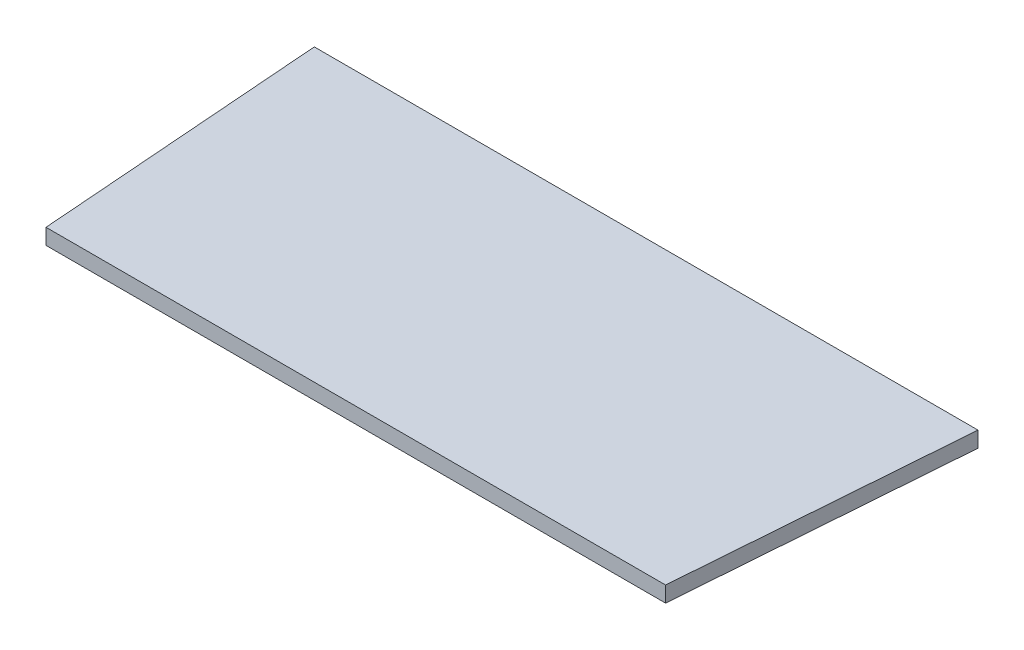
ISO-10303-21;
HEADER;
FILE_DESCRIPTION(('STEP AP214'),'2;1');
FILE_NAME('part.step','',(''),(''),'','','');
FILE_SCHEMA(('AUTOMOTIVE_DESIGN { 1 0 10303 214 1 1 1 1 }'));
ENDSEC;
DATA;
#1=APPLICATION_CONTEXT('core data for automotive mechanical design processes');
#2=APPLICATION_PROTOCOL_DEFINITION('international standard','automotive_design',2000,#1);
#3=PRODUCT_CONTEXT('',#1,'mechanical');
#4=PRODUCT('Part','Part','',(#3));
#5=PRODUCT_RELATED_PRODUCT_CATEGORY('part','',(#4));
#6=PRODUCT_DEFINITION_FORMATION('','',#4);
#7=PRODUCT_DEFINITION_CONTEXT('part definition',#1,'design');
#8=PRODUCT_DEFINITION('design','',#6,#7);
#9=PRODUCT_DEFINITION_SHAPE('','',#8);
#10=(LENGTH_UNIT() NAMED_UNIT(*) SI_UNIT(.MILLI.,.METRE.));
#11=(NAMED_UNIT(*) PLANE_ANGLE_UNIT() SI_UNIT($,.RADIAN.));
#12=(NAMED_UNIT(*) SI_UNIT($,.STERADIAN.) SOLID_ANGLE_UNIT());
#13=UNCERTAINTY_MEASURE_WITH_UNIT(LENGTH_MEASURE(1.E-05),#10,'distance_accuracy_value','');
#14=(GEOMETRIC_REPRESENTATION_CONTEXT(3) GLOBAL_UNCERTAINTY_ASSIGNED_CONTEXT((#13)) GLOBAL_UNIT_ASSIGNED_CONTEXT((#10,
#11,#12)) REPRESENTATION_CONTEXT('',''));
#15=CARTESIAN_POINT('',(0.,0.,0.));
#16=DIRECTION('',(0.,0.,1.));
#17=DIRECTION('',(1.,0.,0.));
#18=AXIS2_PLACEMENT_3D('',#15,#16,#17);
#19=CARTESIAN_POINT('',(-1045.5,26.5,490.));
#20=DIRECTION('',(0.997122913018406,0.,-0.0758016908366033));
#21=DIRECTION('',(-0.0758016908366033,0.,-0.997122913018406));
#22=AXIS2_PLACEMENT_3D('',#19,#20,#21);
#23=PLANE('',#22);
#24=DIRECTION('',(0.0758016908366033,0.,0.997122913018406));
#25=VECTOR('',#24,1.);
#26=CARTESIAN_POINT('',(-1045.5,-26.5,490.));
#27=LINE('',#26,#25);
#28=CARTESIAN_POINT('',(-1120.,-26.5,-490.));
#29=VERTEX_POINT('',#28);
#30=CARTESIAN_POINT('',(-1045.5,-26.5,490.));
#31=VERTEX_POINT('',#30);
#32=EDGE_CURVE('E97',#29,#31,#27,.T.);
#33=ORIENTED_EDGE('',*,*,#32,.T.);
#34=DIRECTION('',(0.,-1.,0.));
#35=VECTOR('',#34,1.);
#36=CARTESIAN_POINT('',(-1045.5,26.5,490.));
#37=LINE('',#36,#35);
#38=CARTESIAN_POINT('',(-1045.5,26.5,490.));
#39=VERTEX_POINT('',#38);
#40=EDGE_CURVE('E11',#39,#31,#37,.T.);
#41=ORIENTED_EDGE('',*,*,#40,.F.);
#42=DIRECTION('',(0.0758016908366033,0.,0.997122913018406));
#43=VECTOR('',#42,1.);
#44=CARTESIAN_POINT('',(-1045.5,26.5,490.));
#45=LINE('',#44,#43);
#46=CARTESIAN_POINT('',(-1120.,26.5,-490.));
#47=VERTEX_POINT('',#46);
#48=EDGE_CURVE('E85',#47,#39,#45,.T.);
#49=ORIENTED_EDGE('',*,*,#48,.F.);
#50=DIRECTION('',(0.,-1.,0.));
#51=VECTOR('',#50,1.);
#52=CARTESIAN_POINT('',(-1120.,26.5,-490.));
#53=LINE('',#52,#51);
#54=EDGE_CURVE('E93',#47,#29,#53,.T.);
#55=ORIENTED_EDGE('',*,*,#54,.T.);
#56=EDGE_LOOP('',(#33,#41,#49,#55));
#57=FACE_BOUND('',#56,.T.);
#58=ADVANCED_FACE('F34',(#57),#23,.F.);
#59=CARTESIAN_POINT('',(1045.5,26.5,490.));
#60=DIRECTION('',(0.,0.,-1.));
#61=DIRECTION('',(-1.,0.,0.));
#62=AXIS2_PLACEMENT_3D('',#59,#60,#61);
#63=PLANE('',#62);
#64=DIRECTION('',(1.,0.,0.));
#65=VECTOR('',#64,1.);
#66=CARTESIAN_POINT('',(1045.5,-26.5,490.));
#67=LINE('',#66,#65);
#68=CARTESIAN_POINT('',(1045.5,-26.5,490.));
#69=VERTEX_POINT('',#68);
#70=EDGE_CURVE('E89',#31,#69,#67,.T.);
#71=ORIENTED_EDGE('',*,*,#70,.T.);
#72=DIRECTION('',(0.,-1.,0.));
#73=VECTOR('',#72,1.);
#74=CARTESIAN_POINT('',(1045.5,26.5,490.));
#75=LINE('',#74,#73);
#76=CARTESIAN_POINT('',(1045.5,26.5,490.));
#77=VERTEX_POINT('',#76);
#78=EDGE_CURVE('E42',#77,#69,#75,.T.);
#79=ORIENTED_EDGE('',*,*,#78,.F.);
#80=DIRECTION('',(1.,0.,0.));
#81=VECTOR('',#80,1.);
#82=CARTESIAN_POINT('',(1045.5,26.5,490.));
#83=LINE('',#82,#81);
#84=EDGE_CURVE('E80',#39,#77,#83,.T.);
#85=ORIENTED_EDGE('',*,*,#84,.F.);
#86=ORIENTED_EDGE('',*,*,#40,.T.);
#87=EDGE_LOOP('',(#71,#79,#85,#86));
#88=FACE_BOUND('',#87,.T.);
#89=ADVANCED_FACE('F88',(#88),#63,.F.);
#90=CARTESIAN_POINT('',(1120.,26.5,-490.000000000001));
#91=DIRECTION('',(-0.997122913018406,0.,-0.0758016908366033));
#92=DIRECTION('',(-0.0758016908366033,0.,0.997122913018406));
#93=AXIS2_PLACEMENT_3D('',#90,#91,#92);
#94=PLANE('',#93);
#95=DIRECTION('',(0.0758016908366033,0.,-0.997122913018406));
#96=VECTOR('',#95,1.);
#97=CARTESIAN_POINT('',(1120.,-26.5,-490.000000000001));
#98=LINE('',#97,#96);
#99=CARTESIAN_POINT('',(1120.,-26.5,-490.000000000001));
#100=VERTEX_POINT('',#99);
#101=EDGE_CURVE('E67',#69,#100,#98,.T.);
#102=ORIENTED_EDGE('',*,*,#101,.T.);
#103=DIRECTION('',(0.,-1.,0.));
#104=VECTOR('',#103,1.);
#105=CARTESIAN_POINT('',(1120.,26.5,-490.000000000001));
#106=LINE('',#105,#104);
#107=CARTESIAN_POINT('',(1120.,26.5,-490.000000000001));
#108=VERTEX_POINT('',#107);
#109=EDGE_CURVE('E90',#108,#100,#106,.T.);
#110=ORIENTED_EDGE('',*,*,#109,.F.);
#111=DIRECTION('',(0.0758016908366033,0.,-0.997122913018406));
#112=VECTOR('',#111,1.);
#113=CARTESIAN_POINT('',(1120.,26.5,-490.000000000001));
#114=LINE('',#113,#112);
#115=EDGE_CURVE('E83',#77,#108,#114,.T.);
#116=ORIENTED_EDGE('',*,*,#115,.F.);
#117=ORIENTED_EDGE('',*,*,#78,.T.);
#118=EDGE_LOOP('',(#102,#110,#116,#117));
#119=FACE_BOUND('',#118,.T.);
#120=ADVANCED_FACE('F91',(#119),#94,.F.);
#121=CARTESIAN_POINT('',(-1120.,26.5,-490.));
#122=DIRECTION('',(0.,0.,1.));
#123=DIRECTION('',(1.,0.,0.));
#124=AXIS2_PLACEMENT_3D('',#121,#122,#123);
#125=PLANE('',#124);
#126=DIRECTION('',(-1.,0.,0.));
#127=VECTOR('',#126,1.);
#128=CARTESIAN_POINT('',(-1120.,-26.5,-490.));
#129=LINE('',#128,#127);
#130=EDGE_CURVE('E73',#100,#29,#129,.T.);
#131=ORIENTED_EDGE('',*,*,#130,.T.);
#132=ORIENTED_EDGE('',*,*,#54,.F.);
#133=DIRECTION('',(-1.,0.,0.));
#134=VECTOR('',#133,1.);
#135=CARTESIAN_POINT('',(-1120.,26.5,-490.));
#136=LINE('',#135,#134);
#137=EDGE_CURVE('E50',#108,#47,#136,.T.);
#138=ORIENTED_EDGE('',*,*,#137,.F.);
#139=ORIENTED_EDGE('',*,*,#109,.T.);
#140=EDGE_LOOP('',(#131,#132,#138,#139));
#141=FACE_BOUND('',#140,.T.);
#142=ADVANCED_FACE('F104',(#141),#125,.F.);
#143=CARTESIAN_POINT('',(0.,26.5,0.));
#144=DIRECTION('',(0.,-1.,0.));
#145=DIRECTION('',(0.,0.,-1.));
#146=AXIS2_PLACEMENT_3D('',#143,#144,#145);
#147=PLANE('',#146);
#148=ORIENTED_EDGE('',*,*,#48,.T.);
#149=ORIENTED_EDGE('',*,*,#84,.T.);
#150=ORIENTED_EDGE('',*,*,#115,.T.);
#151=ORIENTED_EDGE('',*,*,#137,.T.);
#152=EDGE_LOOP('',(#148,#149,#150,#151));
#153=FACE_BOUND('',#152,.T.);
#154=ADVANCED_FACE('F81',(#153),#147,.F.);
#155=CARTESIAN_POINT('',(0.,-26.5,0.));
#156=DIRECTION('',(0.,-1.,0.));
#157=DIRECTION('',(0.,0.,-1.));
#158=AXIS2_PLACEMENT_3D('',#155,#156,#157);
#159=PLANE('',#158);
#160=ORIENTED_EDGE('',*,*,#32,.F.);
#161=ORIENTED_EDGE('',*,*,#130,.F.);
#162=ORIENTED_EDGE('',*,*,#101,.F.);
#163=ORIENTED_EDGE('',*,*,#70,.F.);
#164=EDGE_LOOP('',(#160,#161,#162,#163));
#165=FACE_BOUND('',#164,.T.);
#166=ADVANCED_FACE('F107',(#165),#159,.T.);
#167=CLOSED_SHELL('',(#58,#89,#120,#142,#154,#166));
#168=MANIFOLD_SOLID_BREP('B2',#167);
#169=ADVANCED_BREP_SHAPE_REPRESENTATION('',(#18,#168),#14);
#170=SHAPE_DEFINITION_REPRESENTATION(#9,#169);
ENDSEC;
END-ISO-10303-21;
